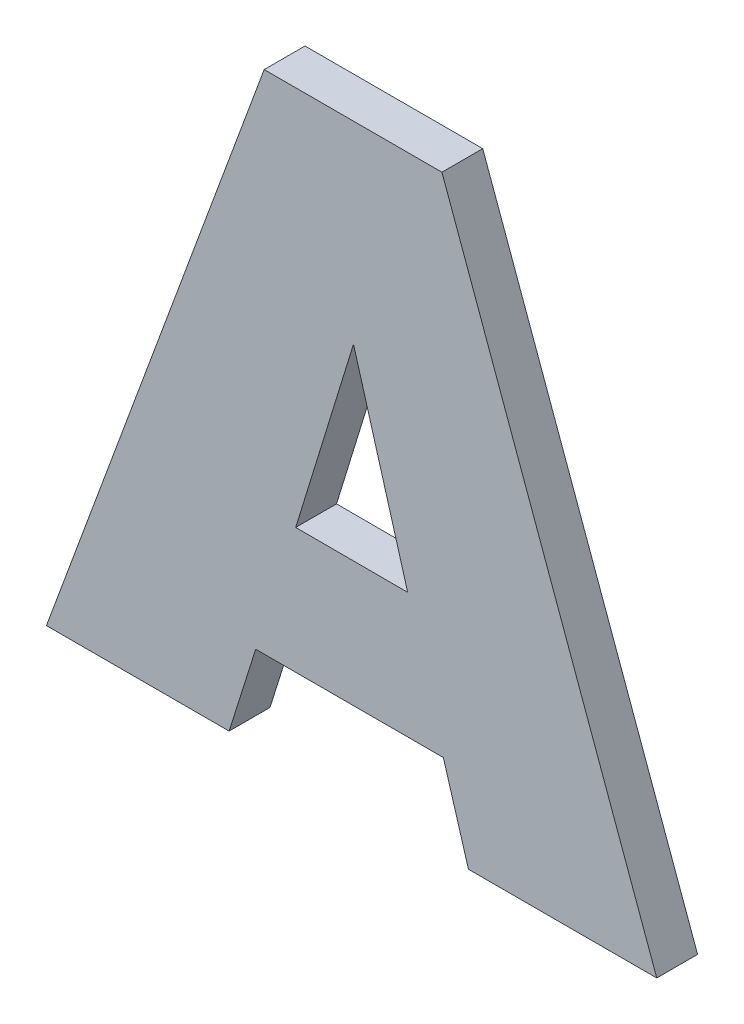
ISO-10303-21;
HEADER;
FILE_DESCRIPTION(('STEP AP214'),'2;1');
FILE_NAME('part.step','',(''),(''),'','','');
FILE_SCHEMA(('AUTOMOTIVE_DESIGN { 1 0 10303 214 1 1 1 1 }'));
ENDSEC;
DATA;
#1=APPLICATION_CONTEXT('core data for automotive mechanical design processes');
#2=APPLICATION_PROTOCOL_DEFINITION('international standard','automotive_design',2000,#1);
#3=PRODUCT_CONTEXT('',#1,'mechanical');
#4=PRODUCT('Part','Part','',(#3));
#5=PRODUCT_RELATED_PRODUCT_CATEGORY('part','',(#4));
#6=PRODUCT_DEFINITION_FORMATION('','',#4);
#7=PRODUCT_DEFINITION_CONTEXT('part definition',#1,'design');
#8=PRODUCT_DEFINITION('design','',#6,#7);
#9=PRODUCT_DEFINITION_SHAPE('','',#8);
#10=(LENGTH_UNIT() NAMED_UNIT(*) SI_UNIT(.MILLI.,.METRE.));
#11=(NAMED_UNIT(*) PLANE_ANGLE_UNIT() SI_UNIT($,.RADIAN.));
#12=(NAMED_UNIT(*) SI_UNIT($,.STERADIAN.) SOLID_ANGLE_UNIT());
#13=UNCERTAINTY_MEASURE_WITH_UNIT(LENGTH_MEASURE(1.E-05),#10,'distance_accuracy_value','');
#14=(GEOMETRIC_REPRESENTATION_CONTEXT(3) GLOBAL_UNCERTAINTY_ASSIGNED_CONTEXT((#13)) GLOBAL_UNIT_ASSIGNED_CONTEXT((#10,
#11,#12)) REPRESENTATION_CONTEXT('',''));
#15=CARTESIAN_POINT('',(0.,0.,0.));
#16=DIRECTION('',(0.,0.,1.));
#17=DIRECTION('',(1.,0.,0.));
#18=AXIS2_PLACEMENT_3D('',#15,#16,#17);
#19=CARTESIAN_POINT('',(0.,0.,0.05));
#20=DIRECTION('',(0.,0.,1.));
#21=DIRECTION('',(1.,0.,0.));
#22=AXIS2_PLACEMENT_3D('',#19,#20,#21);
#23=PLANE('',#22);
#24=DIRECTION('',(0.294390052595791,0.95568535456637,0.));
#25=VECTOR('',#24,1.);
#26=CARTESIAN_POINT('',(5.223002,0.911352,0.05));
#27=LINE('',#26,#25);
#28=CARTESIAN_POINT('',(5.29379519142703,1.14116960305199,0.05));
#29=VERTEX_POINT('',#28);
#30=CARTESIAN_POINT('',(5.223002,0.911352,0.05));
#31=VERTEX_POINT('',#30);
#32=EDGE_CURVE('E153',#29,#31,#27,.F.);
#33=ORIENTED_EDGE('',*,*,#32,.F.);
#34=DIRECTION('',(0.277160651302197,-0.96082359118089,0.));
#35=VECTOR('',#34,1.);
#36=CARTESIAN_POINT('',(5.293795191427,1.141169603052,0.05));
#37=LINE('',#36,#35);
#38=CARTESIAN_POINT('',(5.36016199999993,0.91109799999998,0.05));
#39=VERTEX_POINT('',#38);
#40=EDGE_CURVE('E144',#39,#29,#37,.F.);
#41=ORIENTED_EDGE('',*,*,#40,.F.);
#42=DIRECTION('',(-0.99999828532677,0.00185184867653194,0.));
#43=VECTOR('',#42,1.);
#44=CARTESIAN_POINT('',(5.360162,0.911098,0.05));
#45=LINE('',#44,#43);
#46=EDGE_CURVE('E146',#31,#39,#45,.F.);
#47=ORIENTED_EDGE('',*,*,#46,.F.);
#48=EDGE_LOOP('',(#33,#41,#47));
#49=FACE_BOUND('',#48,.T.);
#50=DIRECTION('',(-0.346026045702516,-0.938224906776344,0.));
#51=VECTOR('',#50,1.);
#52=CARTESIAN_POINT('',(5.184394,1.377696,0.05));
#53=LINE('',#52,#51);
#54=CARTESIAN_POINT('',(4.91769400000001,0.654557999999998,0.05));
#55=VERTEX_POINT('',#54);
#56=CARTESIAN_POINT('',(5.184394,1.377696,0.05));
#57=VERTEX_POINT('',#56);
#58=EDGE_CURVE('E112',#55,#57,#53,.F.);
#59=ORIENTED_EDGE('',*,*,#58,.F.);
#60=DIRECTION('',(1.,0.,0.));
#61=VECTOR('',#60,1.);
#62=CARTESIAN_POINT('',(4.917694,0.654558,0.05));
#63=LINE('',#62,#61);
#64=CARTESIAN_POINT('',(5.141468,0.654558,0.05));
#65=VERTEX_POINT('',#64);
#66=EDGE_CURVE('E20',#65,#55,#63,.F.);
#67=ORIENTED_EDGE('',*,*,#66,.F.);
#68=DIRECTION('',(0.300681637418897,0.953724568687989,0.));
#69=VECTOR('',#68,1.);
#70=CARTESIAN_POINT('',(5.141468,0.654558,0.05));
#71=LINE('',#70,#69);
#72=CARTESIAN_POINT('',(5.17398,0.757682,0.05));
#73=VERTEX_POINT('',#72);
#74=EDGE_CURVE('E101',#73,#65,#71,.F.);
#75=ORIENTED_EDGE('',*,*,#74,.F.);
#76=DIRECTION('',(1.,0.,0.));
#77=VECTOR('',#76,1.);
#78=CARTESIAN_POINT('',(5.17398,0.757682,0.05));
#79=LINE('',#78,#77);
#80=CARTESIAN_POINT('',(5.40385,0.757682,0.05));
#81=VERTEX_POINT('',#80);
#82=EDGE_CURVE('E96',#81,#73,#79,.F.);
#83=ORIENTED_EDGE('',*,*,#82,.F.);
#84=DIRECTION('',(0.285614972005808,-0.958344451523627,0.));
#85=VECTOR('',#84,1.);
#86=CARTESIAN_POINT('',(5.40385,0.757682,0.05));
#87=LINE('',#86,#85);
#88=CARTESIAN_POINT('',(5.434584,0.654558,0.05));
#89=VERTEX_POINT('',#88);
#90=EDGE_CURVE('E123',#89,#81,#87,.F.);
#91=ORIENTED_EDGE('',*,*,#90,.F.);
#92=DIRECTION('',(1.,0.,0.));
#93=VECTOR('',#92,1.);
#94=CARTESIAN_POINT('',(5.434584,0.654558,0.05));
#95=LINE('',#94,#93);
#96=CARTESIAN_POINT('',(5.665216,0.654558,0.05));
#97=VERTEX_POINT('',#96);
#98=EDGE_CURVE('E127',#97,#89,#95,.F.);
#99=ORIENTED_EDGE('',*,*,#98,.F.);
#100=DIRECTION('',(-0.341955071738709,0.939716302355224,0.));
#101=VECTOR('',#100,1.);
#102=CARTESIAN_POINT('',(5.665216,0.654558,0.05));
#103=LINE('',#102,#101);
#104=CARTESIAN_POINT('',(5.402072,1.377696,0.05));
#105=VERTEX_POINT('',#104);
#106=EDGE_CURVE('E131',#105,#97,#103,.F.);
#107=ORIENTED_EDGE('',*,*,#106,.F.);
#108=DIRECTION('',(1.,0.,0.));
#109=VECTOR('',#108,1.);
#110=CARTESIAN_POINT('',(5.402072,1.377696,0.05));
#111=LINE('',#110,#109);
#112=EDGE_CURVE('E135',#57,#105,#111,.T.);
#113=ORIENTED_EDGE('',*,*,#112,.F.);
#114=EDGE_LOOP('',(#59,#67,#75,#83,#91,#99,#107,#113));
#115=FACE_BOUND('',#114,.T.);
#116=ADVANCED_FACE('F17',(#49,#115),#23,.T.);
#117=CARTESIAN_POINT('',(4.917694,0.654558,0.));
#118=DIRECTION('',(0.,-1.,0.));
#119=DIRECTION('',(0.,0.,-1.));
#120=AXIS2_PLACEMENT_3D('',#117,#118,#119);
#121=PLANE('',#120);
#122=DIRECTION('',(0.,0.,1.));
#123=VECTOR('',#122,1.);
#124=CARTESIAN_POINT('',(4.91769400000002,0.654557999999991,0.));
#125=LINE('',#124,#123);
#126=CARTESIAN_POINT('',(4.91769400000001,0.654557999999998,0.));
#127=VERTEX_POINT('',#126);
#128=EDGE_CURVE('E139',#127,#55,#125,.T.);
#129=ORIENTED_EDGE('',*,*,#128,.F.);
#130=DIRECTION('',(1.,0.,0.));
#131=VECTOR('',#130,1.);
#132=CARTESIAN_POINT('',(0.,0.654558,0.));
#133=LINE('',#132,#131);
#134=CARTESIAN_POINT('',(5.141468,0.654558,0.));
#135=VERTEX_POINT('',#134);
#136=EDGE_CURVE('E118',#127,#135,#133,.T.);
#137=ORIENTED_EDGE('',*,*,#136,.T.);
#138=DIRECTION('',(0.,0.,1.));
#139=VECTOR('',#138,1.);
#140=CARTESIAN_POINT('',(5.141468,0.654558,0.));
#141=LINE('',#140,#139);
#142=EDGE_CURVE('E106',#65,#135,#141,.F.);
#143=ORIENTED_EDGE('',*,*,#142,.F.);
#144=ORIENTED_EDGE('',*,*,#66,.T.);
#145=EDGE_LOOP('',(#129,#137,#143,#144));
#146=FACE_BOUND('',#145,.T.);
#147=ADVANCED_FACE('F117',(#146),#121,.T.);
#148=CARTESIAN_POINT('',(5.141468,0.654558,0.));
#149=DIRECTION('',(0.953724568687989,-0.300681637418897,0.));
#150=DIRECTION('',(0.300681637418897,0.953724568687989,0.));
#151=AXIS2_PLACEMENT_3D('',#148,#149,#150);
#152=PLANE('',#151);
#153=ORIENTED_EDGE('',*,*,#142,.T.);
#154=DIRECTION('',(0.300681637418884,0.953724568687993,0.));
#155=VECTOR('',#154,1.);
#156=CARTESIAN_POINT('',(5.141468,0.654558,0.));
#157=LINE('',#156,#155);
#158=CARTESIAN_POINT('',(5.17398,0.757682,0.));
#159=VERTEX_POINT('',#158);
#160=EDGE_CURVE('E157',#135,#159,#157,.T.);
#161=ORIENTED_EDGE('',*,*,#160,.T.);
#162=DIRECTION('',(0.,0.,-1.));
#163=VECTOR('',#162,1.);
#164=CARTESIAN_POINT('',(5.17398,0.757682,0.));
#165=LINE('',#164,#163);
#166=EDGE_CURVE('E108',#73,#159,#165,.T.);
#167=ORIENTED_EDGE('',*,*,#166,.F.);
#168=ORIENTED_EDGE('',*,*,#74,.T.);
#169=EDGE_LOOP('',(#153,#161,#167,#168));
#170=FACE_BOUND('',#169,.T.);
#171=ADVANCED_FACE('F103',(#170),#152,.T.);
#172=CARTESIAN_POINT('',(5.17398,0.757682,0.));
#173=DIRECTION('',(0.,-1.,0.));
#174=DIRECTION('',(0.,0.,-1.));
#175=AXIS2_PLACEMENT_3D('',#172,#173,#174);
#176=PLANE('',#175);
#177=ORIENTED_EDGE('',*,*,#166,.T.);
#178=DIRECTION('',(1.,0.,0.));
#179=VECTOR('',#178,1.);
#180=CARTESIAN_POINT('',(0.,0.757682,0.));
#181=LINE('',#180,#179);
#182=CARTESIAN_POINT('',(5.40385,0.757682,0.));
#183=VERTEX_POINT('',#182);
#184=EDGE_CURVE('E159',#159,#183,#181,.T.);
#185=ORIENTED_EDGE('',*,*,#184,.T.);
#186=DIRECTION('',(0.,0.,1.));
#187=VECTOR('',#186,1.);
#188=CARTESIAN_POINT('',(5.40385,0.757682,0.));
#189=LINE('',#188,#187);
#190=EDGE_CURVE('E125',#81,#183,#189,.F.);
#191=ORIENTED_EDGE('',*,*,#190,.F.);
#192=ORIENTED_EDGE('',*,*,#82,.T.);
#193=EDGE_LOOP('',(#177,#185,#191,#192));
#194=FACE_BOUND('',#193,.T.);
#195=ADVANCED_FACE('F225',(#194),#176,.T.);
#196=CARTESIAN_POINT('',(5.40385,0.757682,0.));
#197=DIRECTION('',(-0.958344451523627,-0.285614972005808,0.));
#198=DIRECTION('',(0.285614972005808,-0.958344451523627,0.));
#199=AXIS2_PLACEMENT_3D('',#196,#197,#198);
#200=PLANE('',#199);
#201=ORIENTED_EDGE('',*,*,#190,.T.);
#202=DIRECTION('',(0.285614972005811,-0.958344451523626,0.));
#203=VECTOR('',#202,1.);
#204=CARTESIAN_POINT('',(5.40385,0.757682,0.));
#205=LINE('',#204,#203);
#206=CARTESIAN_POINT('',(5.434584,0.654558,0.));
#207=VERTEX_POINT('',#206);
#208=EDGE_CURVE('E162',#183,#207,#205,.T.);
#209=ORIENTED_EDGE('',*,*,#208,.T.);
#210=DIRECTION('',(0.,0.,-1.));
#211=VECTOR('',#210,1.);
#212=CARTESIAN_POINT('',(5.434584,0.654558,0.));
#213=LINE('',#212,#211);
#214=EDGE_CURVE('E129',#89,#207,#213,.T.);
#215=ORIENTED_EDGE('',*,*,#214,.F.);
#216=ORIENTED_EDGE('',*,*,#90,.T.);
#217=EDGE_LOOP('',(#201,#209,#215,#216));
#218=FACE_BOUND('',#217,.T.);
#219=ADVANCED_FACE('F221',(#218),#200,.T.);
#220=CARTESIAN_POINT('',(5.434584,0.654558,0.));
#221=DIRECTION('',(0.,-1.,0.));
#222=DIRECTION('',(0.,0.,-1.));
#223=AXIS2_PLACEMENT_3D('',#220,#221,#222);
#224=PLANE('',#223);
#225=ORIENTED_EDGE('',*,*,#214,.T.);
#226=DIRECTION('',(1.,0.,0.));
#227=VECTOR('',#226,1.);
#228=CARTESIAN_POINT('',(0.,0.654558,0.));
#229=LINE('',#228,#227);
#230=CARTESIAN_POINT('',(5.665216,0.654558,0.));
#231=VERTEX_POINT('',#230);
#232=EDGE_CURVE('E165',#207,#231,#229,.T.);
#233=ORIENTED_EDGE('',*,*,#232,.T.);
#234=DIRECTION('',(0.,0.,1.));
#235=VECTOR('',#234,1.);
#236=CARTESIAN_POINT('',(5.665216,0.654558,0.));
#237=LINE('',#236,#235);
#238=EDGE_CURVE('E133',#97,#231,#237,.F.);
#239=ORIENTED_EDGE('',*,*,#238,.F.);
#240=ORIENTED_EDGE('',*,*,#98,.T.);
#241=EDGE_LOOP('',(#225,#233,#239,#240));
#242=FACE_BOUND('',#241,.T.);
#243=ADVANCED_FACE('F217',(#242),#224,.T.);
#244=CARTESIAN_POINT('',(5.665216,0.654558,0.));
#245=DIRECTION('',(0.939716302355224,0.341955071738709,0.));
#246=DIRECTION('',(-0.341955071738709,0.939716302355224,0.));
#247=AXIS2_PLACEMENT_3D('',#244,#245,#246);
#248=PLANE('',#247);
#249=ORIENTED_EDGE('',*,*,#238,.T.);
#250=DIRECTION('',(-0.341955071738679,0.939716302355235,0.));
#251=VECTOR('',#250,1.);
#252=CARTESIAN_POINT('',(5.665216,0.654558,0.));
#253=LINE('',#252,#251);
#254=CARTESIAN_POINT('',(5.40207199999999,1.377696,0.));
#255=VERTEX_POINT('',#254);
#256=EDGE_CURVE('E168',#231,#255,#253,.T.);
#257=ORIENTED_EDGE('',*,*,#256,.T.);
#258=DIRECTION('',(0.,0.,1.));
#259=VECTOR('',#258,1.);
#260=CARTESIAN_POINT('',(5.402072,1.377696,0.));
#261=LINE('',#260,#259);
#262=EDGE_CURVE('E137',#105,#255,#261,.F.);
#263=ORIENTED_EDGE('',*,*,#262,.F.);
#264=ORIENTED_EDGE('',*,*,#106,.T.);
#265=EDGE_LOOP('',(#249,#257,#263,#264));
#266=FACE_BOUND('',#265,.T.);
#267=ADVANCED_FACE('F213',(#266),#248,.T.);
#268=CARTESIAN_POINT('',(5.402072,1.377696,0.));
#269=DIRECTION('',(0.,1.,0.));
#270=DIRECTION('',(0.,0.,1.));
#271=AXIS2_PLACEMENT_3D('',#268,#269,#270);
#272=PLANE('',#271);
#273=ORIENTED_EDGE('',*,*,#262,.T.);
#274=DIRECTION('',(1.,0.,0.));
#275=VECTOR('',#274,1.);
#276=CARTESIAN_POINT('',(0.,1.377696,0.));
#277=LINE('',#276,#275);
#278=CARTESIAN_POINT('',(5.184394,1.377696,0.));
#279=VERTEX_POINT('',#278);
#280=EDGE_CURVE('E171',#255,#279,#277,.F.);
#281=ORIENTED_EDGE('',*,*,#280,.T.);
#282=DIRECTION('',(0.,0.,1.));
#283=VECTOR('',#282,1.);
#284=CARTESIAN_POINT('',(5.184394,1.377696,0.));
#285=LINE('',#284,#283);
#286=EDGE_CURVE('E142',#57,#279,#285,.F.);
#287=ORIENTED_EDGE('',*,*,#286,.F.);
#288=ORIENTED_EDGE('',*,*,#112,.T.);
#289=EDGE_LOOP('',(#273,#281,#287,#288));
#290=FACE_BOUND('',#289,.T.);
#291=ADVANCED_FACE('F209',(#290),#272,.T.);
#292=CARTESIAN_POINT('',(5.184394,1.377696,0.));
#293=DIRECTION('',(-0.938224906776344,0.346026045702516,0.));
#294=DIRECTION('',(-0.346026045702516,-0.938224906776344,0.));
#295=AXIS2_PLACEMENT_3D('',#292,#293,#294);
#296=PLANE('',#295);
#297=ORIENTED_EDGE('',*,*,#286,.T.);
#298=DIRECTION('',(-0.346026045702546,-0.938224906776333,0.));
#299=VECTOR('',#298,1.);
#300=CARTESIAN_POINT('',(5.184394,1.377696,0.));
#301=LINE('',#300,#299);
#302=EDGE_CURVE('E174',#279,#127,#301,.T.);
#303=ORIENTED_EDGE('',*,*,#302,.T.);
#304=ORIENTED_EDGE('',*,*,#128,.T.);
#305=ORIENTED_EDGE('',*,*,#58,.T.);
#306=EDGE_LOOP('',(#297,#303,#304,#305));
#307=FACE_BOUND('',#306,.T.);
#308=ADVANCED_FACE('F206',(#307),#296,.T.);
#309=CARTESIAN_POINT('',(5.293795191427,1.141169603052,0.));
#310=DIRECTION('',(-0.96082359118089,-0.277160651302197,0.));
#311=DIRECTION('',(0.277160651302197,-0.96082359118089,0.));
#312=AXIS2_PLACEMENT_3D('',#309,#310,#311);
#313=PLANE('',#312);
#314=DIRECTION('',(0.,0.,1.));
#315=VECTOR('',#314,1.);
#316=CARTESIAN_POINT('',(5.29379519142711,1.14116960305196,0.));
#317=LINE('',#316,#315);
#318=CARTESIAN_POINT('',(5.29379519142703,1.14116960305199,0.));
#319=VERTEX_POINT('',#318);
#320=EDGE_CURVE('E150',#319,#29,#317,.T.);
#321=ORIENTED_EDGE('',*,*,#320,.F.);
#322=DIRECTION('',(0.277160651303368,-0.960823591180552,0.));
#323=VECTOR('',#322,1.);
#324=CARTESIAN_POINT('',(5.293795191427,1.141169603052,0.));
#325=LINE('',#324,#323);
#326=CARTESIAN_POINT('',(5.36016199999986,0.911097999999959,0.));
#327=VERTEX_POINT('',#326);
#328=EDGE_CURVE('E177',#319,#327,#325,.T.);
#329=ORIENTED_EDGE('',*,*,#328,.T.);
#330=DIRECTION('',(0.,0.,1.));
#331=VECTOR('',#330,1.);
#332=CARTESIAN_POINT('',(5.360162,0.911098,0.));
#333=LINE('',#332,#331);
#334=EDGE_CURVE('E148',#39,#327,#333,.F.);
#335=ORIENTED_EDGE('',*,*,#334,.F.);
#336=ORIENTED_EDGE('',*,*,#40,.T.);
#337=EDGE_LOOP('',(#321,#329,#335,#336));
#338=FACE_BOUND('',#337,.T.);
#339=ADVANCED_FACE('F190',(#338),#313,.T.);
#340=CARTESIAN_POINT('',(5.360162,0.911098,0.));
#341=DIRECTION('',(0.00185184867653194,0.99999828532677,0.));
#342=DIRECTION('',(-0.99999828532677,0.00185184867653194,0.));
#343=AXIS2_PLACEMENT_3D('',#340,#341,#342);
#344=PLANE('',#343);
#345=ORIENTED_EDGE('',*,*,#334,.T.);
#346=DIRECTION('',(-0.99999828532677,0.00185184867653176,0.));
#347=VECTOR('',#346,1.);
#348=CARTESIAN_POINT('',(5.360162,0.911098,0.));
#349=LINE('',#348,#347);
#350=CARTESIAN_POINT('',(5.223002,0.911352,0.));
#351=VERTEX_POINT('',#350);
#352=EDGE_CURVE('E26',#327,#351,#349,.T.);
#353=ORIENTED_EDGE('',*,*,#352,.T.);
#354=DIRECTION('',(0.,0.,1.));
#355=VECTOR('',#354,1.);
#356=CARTESIAN_POINT('',(5.223002,0.911352,0.));
#357=LINE('',#356,#355);
#358=EDGE_CURVE('E34',#31,#351,#357,.F.);
#359=ORIENTED_EDGE('',*,*,#358,.F.);
#360=ORIENTED_EDGE('',*,*,#46,.T.);
#361=EDGE_LOOP('',(#345,#353,#359,#360));
#362=FACE_BOUND('',#361,.T.);
#363=ADVANCED_FACE('F183',(#362),#344,.T.);
#364=CARTESIAN_POINT('',(5.223002,0.911352,0.));
#365=DIRECTION('',(0.95568535456637,-0.294390052595791,0.));
#366=DIRECTION('',(0.294390052595791,0.95568535456637,0.));
#367=AXIS2_PLACEMENT_3D('',#364,#365,#366);
#368=PLANE('',#367);
#369=ORIENTED_EDGE('',*,*,#358,.T.);
#370=DIRECTION('',(0.294390052595315,0.955685354566516,0.));
#371=VECTOR('',#370,1.);
#372=CARTESIAN_POINT('',(5.223002,0.911352,0.));
#373=LINE('',#372,#371);
#374=EDGE_CURVE('E11',#351,#319,#373,.T.);
#375=ORIENTED_EDGE('',*,*,#374,.T.);
#376=ORIENTED_EDGE('',*,*,#320,.T.);
#377=ORIENTED_EDGE('',*,*,#32,.T.);
#378=EDGE_LOOP('',(#369,#375,#376,#377));
#379=FACE_BOUND('',#378,.T.);
#380=ADVANCED_FACE('F193',(#379),#368,.T.);
#381=CARTESIAN_POINT('',(0.,0.,0.));
#382=DIRECTION('',(0.,0.,1.));
#383=DIRECTION('',(1.,0.,0.));
#384=AXIS2_PLACEMENT_3D('',#381,#382,#383);
#385=PLANE('',#384);
#386=ORIENTED_EDGE('',*,*,#352,.F.);
#387=ORIENTED_EDGE('',*,*,#328,.F.);
#388=ORIENTED_EDGE('',*,*,#374,.F.);
#389=EDGE_LOOP('',(#386,#387,#388));
#390=FACE_BOUND('',#389,.T.);
#391=ORIENTED_EDGE('',*,*,#280,.F.);
#392=ORIENTED_EDGE('',*,*,#256,.F.);
#393=ORIENTED_EDGE('',*,*,#232,.F.);
#394=ORIENTED_EDGE('',*,*,#208,.F.);
#395=ORIENTED_EDGE('',*,*,#184,.F.);
#396=ORIENTED_EDGE('',*,*,#160,.F.);
#397=ORIENTED_EDGE('',*,*,#136,.F.);
#398=ORIENTED_EDGE('',*,*,#302,.F.);
#399=EDGE_LOOP('',(#391,#392,#393,#394,#395,#396,#397,#398));
#400=FACE_BOUND('',#399,.T.);
#401=ADVANCED_FACE('F186',(#390,#400),#385,.F.);
#402=CLOSED_SHELL('',(#116,#147,#171,#195,#219,#243,#267,#291,#308,#339,#363,#380,#401));
#403=MANIFOLD_SOLID_BREP('B1',#402);
#404=ADVANCED_BREP_SHAPE_REPRESENTATION('',(#18,#403),#14);
#405=SHAPE_DEFINITION_REPRESENTATION(#9,#404);
ENDSEC;
END-ISO-10303-21;
